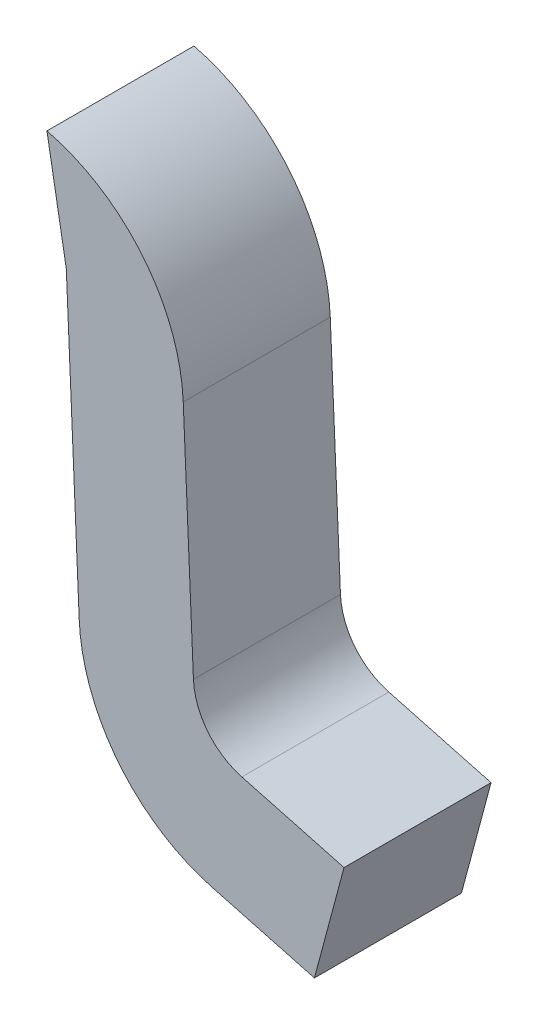
ISO-10303-21;
HEADER;
FILE_DESCRIPTION(('STEP AP214'),'2;1');
FILE_NAME('part.step','',(''),(''),'','','');
FILE_SCHEMA(('AUTOMOTIVE_DESIGN { 1 0 10303 214 1 1 1 1 }'));
ENDSEC;
DATA;
#1=APPLICATION_CONTEXT('core data for automotive mechanical design processes');
#2=APPLICATION_PROTOCOL_DEFINITION('international standard','automotive_design',2000,#1);
#3=PRODUCT_CONTEXT('',#1,'mechanical');
#4=PRODUCT('Part','Part','',(#3));
#5=PRODUCT_RELATED_PRODUCT_CATEGORY('part','',(#4));
#6=PRODUCT_DEFINITION_FORMATION('','',#4);
#7=PRODUCT_DEFINITION_CONTEXT('part definition',#1,'design');
#8=PRODUCT_DEFINITION('design','',#6,#7);
#9=PRODUCT_DEFINITION_SHAPE('','',#8);
#10=(LENGTH_UNIT() NAMED_UNIT(*) SI_UNIT(.MILLI.,.METRE.));
#11=(NAMED_UNIT(*) PLANE_ANGLE_UNIT() SI_UNIT($,.RADIAN.));
#12=(NAMED_UNIT(*) SI_UNIT($,.STERADIAN.) SOLID_ANGLE_UNIT());
#13=UNCERTAINTY_MEASURE_WITH_UNIT(LENGTH_MEASURE(1.E-05),#10,'distance_accuracy_value','');
#14=(GEOMETRIC_REPRESENTATION_CONTEXT(3) GLOBAL_UNCERTAINTY_ASSIGNED_CONTEXT((#13)) GLOBAL_UNIT_ASSIGNED_CONTEXT((#10,
#11,#12)) REPRESENTATION_CONTEXT('',''));
#15=CARTESIAN_POINT('',(0.,0.,0.));
#16=DIRECTION('',(0.,0.,1.));
#17=DIRECTION('',(1.,0.,0.));
#18=AXIS2_PLACEMENT_3D('',#15,#16,#17);
#19=CARTESIAN_POINT('',(1.05,-0.580962980399,-0.5375));
#20=DIRECTION('',(-0.965925826288944,0.258819045102985,0.));
#21=DIRECTION('',(0.258819045102985,0.965925826288944,0.));
#22=AXIS2_PLACEMENT_3D('',#19,#20,#21);
#23=PLANE('',#22);
#24=DIRECTION('',(-0.258819045102985,-0.965925826288944,0.));
#25=VECTOR('',#24,1.);
#26=CARTESIAN_POINT('',(1.05,-0.580962980399,-0.7625));
#27=LINE('',#26,#25);
#28=CARTESIAN_POINT('',(1.05,-0.580962980399,-0.7625));
#29=VERTEX_POINT('',#28);
#30=CARTESIAN_POINT('',(1.004706667107,-0.75,-0.7625));
#31=VERTEX_POINT('',#30);
#32=EDGE_CURVE('E36',#29,#31,#27,.T.);
#33=ORIENTED_EDGE('',*,*,#32,.F.);
#34=DIRECTION('',(0.,0.,-1.));
#35=VECTOR('',#34,1.);
#36=CARTESIAN_POINT('',(1.05,-0.580962980399,-0.5375));
#37=LINE('',#36,#35);
#38=CARTESIAN_POINT('',(1.05,-0.580962980399,-0.5375));
#39=VERTEX_POINT('',#38);
#40=EDGE_CURVE('E110',#39,#29,#37,.T.);
#41=ORIENTED_EDGE('',*,*,#40,.F.);
#42=DIRECTION('',(-0.258819045102985,-0.965925826288944,0.));
#43=VECTOR('',#42,1.);
#44=CARTESIAN_POINT('',(1.05,-0.580962980399,-0.5375));
#45=LINE('',#44,#43);
#46=CARTESIAN_POINT('',(1.004706667107,-0.75,-0.5375));
#47=VERTEX_POINT('',#46);
#48=EDGE_CURVE('E11',#39,#47,#45,.T.);
#49=ORIENTED_EDGE('',*,*,#48,.T.);
#50=DIRECTION('',(0.,0.,-1.));
#51=VECTOR('',#50,1.);
#52=CARTESIAN_POINT('',(1.004706667107,-0.75,-0.5375));
#53=LINE('',#52,#51);
#54=EDGE_CURVE('E27',#47,#31,#53,.T.);
#55=ORIENTED_EDGE('',*,*,#54,.T.);
#56=EDGE_LOOP('',(#33,#41,#49,#55));
#57=FACE_BOUND('',#56,.T.);
#58=ADVANCED_FACE('F17',(#57),#23,.F.);
#59=CARTESIAN_POINT('',(0.848273145765,-0.708083764287,-0.5375));
#60=DIRECTION('',(0.258819045102985,0.965925826288944,0.));
#61=DIRECTION('',(0.965925826288944,-0.258819045102985,0.));
#62=AXIS2_PLACEMENT_3D('',#59,#60,#61);
#63=PLANE('',#62);
#64=DIRECTION('',(-0.965925826288944,0.258819045102985,0.));
#65=VECTOR('',#64,1.);
#66=CARTESIAN_POINT('',(0.848273145765,-0.708083764287,-0.7625));
#67=LINE('',#66,#65);
#68=CARTESIAN_POINT('',(0.848273145765,-0.708083764287,-0.7625));
#69=VERTEX_POINT('',#68);
#70=EDGE_CURVE('E112',#31,#69,#67,.T.);
#71=ORIENTED_EDGE('',*,*,#70,.F.);
#72=ORIENTED_EDGE('',*,*,#54,.F.);
#73=DIRECTION('',(-0.965925826288944,0.258819045102985,0.));
#74=VECTOR('',#73,1.);
#75=CARTESIAN_POINT('',(0.848273145765,-0.708083764287,-0.5375));
#76=LINE('',#75,#74);
#77=CARTESIAN_POINT('',(0.848273145765,-0.708083764287,-0.5375));
#78=VERTEX_POINT('',#77);
#79=EDGE_CURVE('E116',#47,#78,#76,.T.);
#80=ORIENTED_EDGE('',*,*,#79,.T.);
#81=DIRECTION('',(0.,0.,-1.));
#82=VECTOR('',#81,1.);
#83=CARTESIAN_POINT('',(0.848273145765,-0.708083764287,-0.5375));
#84=LINE('',#83,#82);
#85=EDGE_CURVE('E121',#78,#69,#84,.T.);
#86=ORIENTED_EDGE('',*,*,#85,.T.);
#87=EDGE_LOOP('',(#71,#72,#80,#86));
#88=FACE_BOUND('',#87,.T.);
#89=ADVANCED_FACE('F162',(#88),#63,.F.);
#90=CARTESIAN_POINT('',(0.919448383168,-0.442454162058,-0.5375));
#91=DIRECTION('',(0.,0.,-1.));
#92=DIRECTION('',(1.,0.,0.));
#93=AXIS2_PLACEMENT_3D('',#90,#91,#92);
#94=CYLINDRICAL_SURFACE('',#93,0.275);
#95=CARTESIAN_POINT('',(0.919448383168,-0.442454162058,-0.7625));
#96=DIRECTION('',(0.,0.,-1.));
#97=DIRECTION('',(1.,0.,0.));
#98=AXIS2_PLACEMENT_3D('',#95,#96,#97);
#99=CIRCLE('',#98,0.275);
#100=CARTESIAN_POINT('',(0.644706667107,-0.454370094905,-0.7625));
#101=VERTEX_POINT('',#100);
#102=EDGE_CURVE('E118',#69,#101,#99,.T.);
#103=ORIENTED_EDGE('',*,*,#102,.F.);
#104=ORIENTED_EDGE('',*,*,#85,.F.);
#105=CARTESIAN_POINT('',(0.919448383168,-0.442454162058,-0.5375));
#106=DIRECTION('',(0.,0.,-1.));
#107=DIRECTION('',(1.,0.,0.));
#108=AXIS2_PLACEMENT_3D('',#105,#106,#107);
#109=CIRCLE('',#108,0.275);
#110=CARTESIAN_POINT('',(0.644706667107,-0.454370094905,-0.5375));
#111=VERTEX_POINT('',#110);
#112=EDGE_CURVE('E124',#78,#111,#109,.T.);
#113=ORIENTED_EDGE('',*,*,#112,.T.);
#114=DIRECTION('',(0.,0.,-1.));
#115=VECTOR('',#114,1.);
#116=CARTESIAN_POINT('',(0.644706667107,-0.454370094905,-0.5375));
#117=LINE('',#116,#115);
#118=EDGE_CURVE('E129',#111,#101,#117,.T.);
#119=ORIENTED_EDGE('',*,*,#118,.T.);
#120=EDGE_LOOP('',(#103,#104,#113,#119));
#121=FACE_BOUND('',#120,.T.);
#122=ADVANCED_FACE('F166',(#121),#94,.T.);
#123=CARTESIAN_POINT('',(0.625,0.,-0.5375));
#124=DIRECTION('',(0.999060785677877,0.0433306649003147,0.));
#125=DIRECTION('',(0.0433306649003147,-0.999060785677877,0.));
#126=AXIS2_PLACEMENT_3D('',#123,#124,#125);
#127=PLANE('',#126);
#128=DIRECTION('',(-0.0433306649003147,0.999060785677877,0.));
#129=VECTOR('',#128,1.);
#130=CARTESIAN_POINT('',(0.625,0.,-0.7625));
#131=LINE('',#130,#129);
#132=CARTESIAN_POINT('',(0.625,0.,-0.7625));
#133=VERTEX_POINT('',#132);
#134=EDGE_CURVE('E126',#101,#133,#131,.T.);
#135=ORIENTED_EDGE('',*,*,#134,.F.);
#136=ORIENTED_EDGE('',*,*,#118,.F.);
#137=DIRECTION('',(-0.0433306649003147,0.999060785677877,0.));
#138=VECTOR('',#137,1.);
#139=CARTESIAN_POINT('',(0.625,0.,-0.5375));
#140=LINE('',#139,#138);
#141=CARTESIAN_POINT('',(0.625,0.,-0.5375));
#142=VERTEX_POINT('',#141);
#143=EDGE_CURVE('E132',#111,#142,#140,.T.);
#144=ORIENTED_EDGE('',*,*,#143,.T.);
#145=DIRECTION('',(0.,0.,-1.));
#146=VECTOR('',#145,1.);
#147=CARTESIAN_POINT('',(0.625,0.,-0.5375));
#148=LINE('',#147,#146);
#149=EDGE_CURVE('E137',#142,#133,#148,.T.);
#150=ORIENTED_EDGE('',*,*,#149,.T.);
#151=EDGE_LOOP('',(#135,#136,#144,#150));
#152=FACE_BOUND('',#151,.T.);
#153=ADVANCED_FACE('F170',(#152),#127,.F.);
#154=CARTESIAN_POINT('',(0.595372007828,0.168028693356,-0.5375));
#155=DIRECTION('',(0.98480775301219,0.173648177667033,0.));
#156=DIRECTION('',(0.173648177667033,-0.98480775301219,0.));
#157=AXIS2_PLACEMENT_3D('',#154,#155,#156);
#158=PLANE('',#157);
#159=DIRECTION('',(-0.173648177667033,0.98480775301219,0.));
#160=VECTOR('',#159,1.);
#161=CARTESIAN_POINT('',(0.595372007828,0.168028693356,-0.7625));
#162=LINE('',#161,#160);
#163=CARTESIAN_POINT('',(0.595372007828,0.168028693356,-0.7625));
#164=VERTEX_POINT('',#163);
#165=EDGE_CURVE('E134',#133,#164,#162,.T.);
#166=ORIENTED_EDGE('',*,*,#165,.F.);
#167=ORIENTED_EDGE('',*,*,#149,.F.);
#168=DIRECTION('',(-0.173648177667033,0.98480775301219,0.));
#169=VECTOR('',#168,1.);
#170=CARTESIAN_POINT('',(0.595372007828,0.168028693356,-0.5375));
#171=LINE('',#170,#169);
#172=CARTESIAN_POINT('',(0.595372007828,0.168028693356,-0.5375));
#173=VERTEX_POINT('',#172);
#174=EDGE_CURVE('E140',#142,#173,#171,.T.);
#175=ORIENTED_EDGE('',*,*,#174,.T.);
#176=DIRECTION('',(0.,0.,-1.));
#177=VECTOR('',#176,1.);
#178=CARTESIAN_POINT('',(0.595372007828,0.168028693356,-0.5375));
#179=LINE('',#178,#177);
#180=EDGE_CURVE('E145',#173,#164,#179,.T.);
#181=ORIENTED_EDGE('',*,*,#180,.T.);
#182=EDGE_LOOP('',(#166,#167,#175,#181));
#183=FACE_BOUND('',#182,.T.);
#184=ADVANCED_FACE('F174',(#183),#158,.F.);
#185=CARTESIAN_POINT('',(0.529194989095,-0.0988900249678,-0.5375));
#186=DIRECTION('',(0.,0.,-1.));
#187=DIRECTION('',(1.,0.,0.));
#188=AXIS2_PLACEMENT_3D('',#185,#186,#187);
#189=CYLINDRICAL_SURFACE('',#188,0.275);
#190=CARTESIAN_POINT('',(0.529194989095,-0.0988900249678,-0.7625));
#191=DIRECTION('',(0.,0.,-1.));
#192=DIRECTION('',(1.,0.,0.));
#193=AXIS2_PLACEMENT_3D('',#190,#191,#192);
#194=CIRCLE('',#193,0.275);
#195=CARTESIAN_POINT('',(0.803936705157,-0.08697409212022,-0.7625));
#196=VERTEX_POINT('',#195);
#197=EDGE_CURVE('E142',#164,#196,#194,.T.);
#198=ORIENTED_EDGE('',*,*,#197,.F.);
#199=ORIENTED_EDGE('',*,*,#180,.F.);
#200=CARTESIAN_POINT('',(0.529194989095,-0.0988900249678,-0.5375));
#201=DIRECTION('',(0.,0.,-1.));
#202=DIRECTION('',(1.,0.,0.));
#203=AXIS2_PLACEMENT_3D('',#200,#201,#202);
#204=CIRCLE('',#203,0.275);
#205=CARTESIAN_POINT('',(0.803936705157,-0.08697409212022,-0.5375));
#206=VERTEX_POINT('',#205);
#207=EDGE_CURVE('E148',#173,#206,#204,.T.);
#208=ORIENTED_EDGE('',*,*,#207,.T.);
#209=DIRECTION('',(0.,0.,-1.));
#210=VECTOR('',#209,1.);
#211=CARTESIAN_POINT('',(0.803936705157,-0.08697409212022,-0.5375));
#212=LINE('',#211,#210);
#213=EDGE_CURVE('E153',#206,#196,#212,.T.);
#214=ORIENTED_EDGE('',*,*,#213,.T.);
#215=EDGE_LOOP('',(#198,#199,#208,#214));
#216=FACE_BOUND('',#215,.T.);
#217=ADVANCED_FACE('F178',(#216),#189,.T.);
#218=CARTESIAN_POINT('',(0.803936705157,-0.08697409212022,-0.5375));
#219=DIRECTION('',(-0.999060785677877,-0.0433306649003147,0.));
#220=DIRECTION('',(-0.0433306649003147,0.999060785677877,0.));
#221=AXIS2_PLACEMENT_3D('',#218,#219,#220);
#222=PLANE('',#221);
#223=DIRECTION('',(0.0433306649003147,-0.999060785677877,0.));
#224=VECTOR('',#223,1.);
#225=CARTESIAN_POINT('',(0.803936705157,-0.08697409212022,-0.7625));
#226=LINE('',#225,#224);
#227=CARTESIAN_POINT('',(0.819542304601,-0.446787228548,-0.7625));
#228=VERTEX_POINT('',#227);
#229=EDGE_CURVE('E150',#196,#228,#226,.T.);
#230=ORIENTED_EDGE('',*,*,#229,.F.);
#231=ORIENTED_EDGE('',*,*,#213,.F.);
#232=DIRECTION('',(0.0433306649003147,-0.999060785677877,0.));
#233=VECTOR('',#232,1.);
#234=CARTESIAN_POINT('',(0.803936705157,-0.08697409212022,-0.5375));
#235=LINE('',#234,#233);
#236=CARTESIAN_POINT('',(0.819542304601,-0.446787228548,-0.5375));
#237=VERTEX_POINT('',#236);
#238=EDGE_CURVE('E156',#206,#237,#235,.T.);
#239=ORIENTED_EDGE('',*,*,#238,.T.);
#240=DIRECTION('',(0.,0.,-1.));
#241=VECTOR('',#240,1.);
#242=CARTESIAN_POINT('',(0.819542304601,-0.446787228548,-0.5375));
#243=LINE('',#242,#241);
#244=EDGE_CURVE('E102',#237,#228,#243,.T.);
#245=ORIENTED_EDGE('',*,*,#244,.T.);
#246=EDGE_LOOP('',(#230,#231,#239,#245));
#247=FACE_BOUND('',#246,.T.);
#248=ADVANCED_FACE('F181',(#247),#222,.F.);
#249=CARTESIAN_POINT('',(0.919448383168,-0.442454162058,-0.5375));
#250=DIRECTION('',(0.,0.,-1.));
#251=DIRECTION('',(1.,0.,0.));
#252=AXIS2_PLACEMENT_3D('',#249,#250,#251);
#253=CYLINDRICAL_SURFACE('',#252,0.1);
#254=CARTESIAN_POINT('',(0.919448383168,-0.442454162058,-0.7625));
#255=DIRECTION('',(0.,0.,1.));
#256=DIRECTION('',(1.,0.,0.));
#257=AXIS2_PLACEMENT_3D('',#254,#255,#256);
#258=CIRCLE('',#257,0.1);
#259=CARTESIAN_POINT('',(0.893566478658,-0.539046744687,-0.7625));
#260=VERTEX_POINT('',#259);
#261=EDGE_CURVE('E85',#228,#260,#258,.T.);
#262=ORIENTED_EDGE('',*,*,#261,.F.);
#263=ORIENTED_EDGE('',*,*,#244,.F.);
#264=CARTESIAN_POINT('',(0.919448383168,-0.442454162058,-0.5375));
#265=DIRECTION('',(0.,0.,1.));
#266=DIRECTION('',(1.,0.,0.));
#267=AXIS2_PLACEMENT_3D('',#264,#265,#266);
#268=CIRCLE('',#267,0.1);
#269=CARTESIAN_POINT('',(0.893566478658,-0.539046744687,-0.5375));
#270=VERTEX_POINT('',#269);
#271=EDGE_CURVE('E97',#237,#270,#268,.T.);
#272=ORIENTED_EDGE('',*,*,#271,.T.);
#273=DIRECTION('',(0.,0.,-1.));
#274=VECTOR('',#273,1.);
#275=CARTESIAN_POINT('',(0.893566478658,-0.539046744687,-0.5375));
#276=LINE('',#275,#274);
#277=EDGE_CURVE('E91',#270,#260,#276,.T.);
#278=ORIENTED_EDGE('',*,*,#277,.T.);
#279=EDGE_LOOP('',(#262,#263,#272,#278));
#280=FACE_BOUND('',#279,.T.);
#281=ADVANCED_FACE('F100',(#280),#253,.F.);
#282=CARTESIAN_POINT('',(0.893566478658,-0.539046744687,-0.5375));
#283=DIRECTION('',(-0.258819045102985,-0.965925826288944,0.));
#284=DIRECTION('',(-0.965925826288944,0.258819045102985,0.));
#285=AXIS2_PLACEMENT_3D('',#282,#283,#284);
#286=PLANE('',#285);
#287=DIRECTION('',(0.965925826288944,-0.258819045102985,0.));
#288=VECTOR('',#287,1.);
#289=CARTESIAN_POINT('',(0.893566478658,-0.539046744687,-0.7625));
#290=LINE('',#289,#288);
#291=EDGE_CURVE('E95',#260,#29,#290,.T.);
#292=ORIENTED_EDGE('',*,*,#291,.F.);
#293=ORIENTED_EDGE('',*,*,#277,.F.);
#294=DIRECTION('',(0.965925826288944,-0.258819045102985,0.));
#295=VECTOR('',#294,1.);
#296=CARTESIAN_POINT('',(0.893566478658,-0.539046744687,-0.5375));
#297=LINE('',#296,#295);
#298=EDGE_CURVE('E21',#270,#39,#297,.T.);
#299=ORIENTED_EDGE('',*,*,#298,.T.);
#300=ORIENTED_EDGE('',*,*,#40,.T.);
#301=EDGE_LOOP('',(#292,#293,#299,#300));
#302=FACE_BOUND('',#301,.T.);
#303=ADVANCED_FACE('F93',(#302),#286,.F.);
#304=CARTESIAN_POINT('',(0.919448383168,-0.442454162058,-0.5375));
#305=DIRECTION('',(0.,0.,-1.));
#306=DIRECTION('',(1.,0.,0.));
#307=AXIS2_PLACEMENT_3D('',#304,#305,#306);
#308=PLANE('',#307);
#309=ORIENTED_EDGE('',*,*,#48,.F.);
#310=ORIENTED_EDGE('',*,*,#298,.F.);
#311=ORIENTED_EDGE('',*,*,#271,.F.);
#312=ORIENTED_EDGE('',*,*,#238,.F.);
#313=ORIENTED_EDGE('',*,*,#207,.F.);
#314=ORIENTED_EDGE('',*,*,#174,.F.);
#315=ORIENTED_EDGE('',*,*,#143,.F.);
#316=ORIENTED_EDGE('',*,*,#112,.F.);
#317=ORIENTED_EDGE('',*,*,#79,.F.);
#318=EDGE_LOOP('',(#309,#310,#311,#312,#313,#314,#315,#316,#317));
#319=FACE_BOUND('',#318,.T.);
#320=ADVANCED_FACE('F108',(#319),#308,.F.);
#321=CARTESIAN_POINT('',(0.919448383168,-0.442454162058,-0.7625));
#322=DIRECTION('',(0.,0.,-1.));
#323=DIRECTION('',(1.,0.,0.));
#324=AXIS2_PLACEMENT_3D('',#321,#322,#323);
#325=PLANE('',#324);
#326=ORIENTED_EDGE('',*,*,#32,.T.);
#327=ORIENTED_EDGE('',*,*,#70,.T.);
#328=ORIENTED_EDGE('',*,*,#102,.T.);
#329=ORIENTED_EDGE('',*,*,#134,.T.);
#330=ORIENTED_EDGE('',*,*,#165,.T.);
#331=ORIENTED_EDGE('',*,*,#197,.T.);
#332=ORIENTED_EDGE('',*,*,#229,.T.);
#333=ORIENTED_EDGE('',*,*,#261,.T.);
#334=ORIENTED_EDGE('',*,*,#291,.T.);
#335=EDGE_LOOP('',(#326,#327,#328,#329,#330,#331,#332,#333,#334));
#336=FACE_BOUND('',#335,.T.);
#337=ADVANCED_FACE('F19',(#336),#325,.T.);
#338=CLOSED_SHELL('',(#58,#89,#122,#153,#184,#217,#248,#281,#303,#320,#337));
#339=MANIFOLD_SOLID_BREP('B1',#338);
#340=ADVANCED_BREP_SHAPE_REPRESENTATION('',(#18,#339),#14);
#341=SHAPE_DEFINITION_REPRESENTATION(#9,#340);
ENDSEC;
END-ISO-10303-21;
